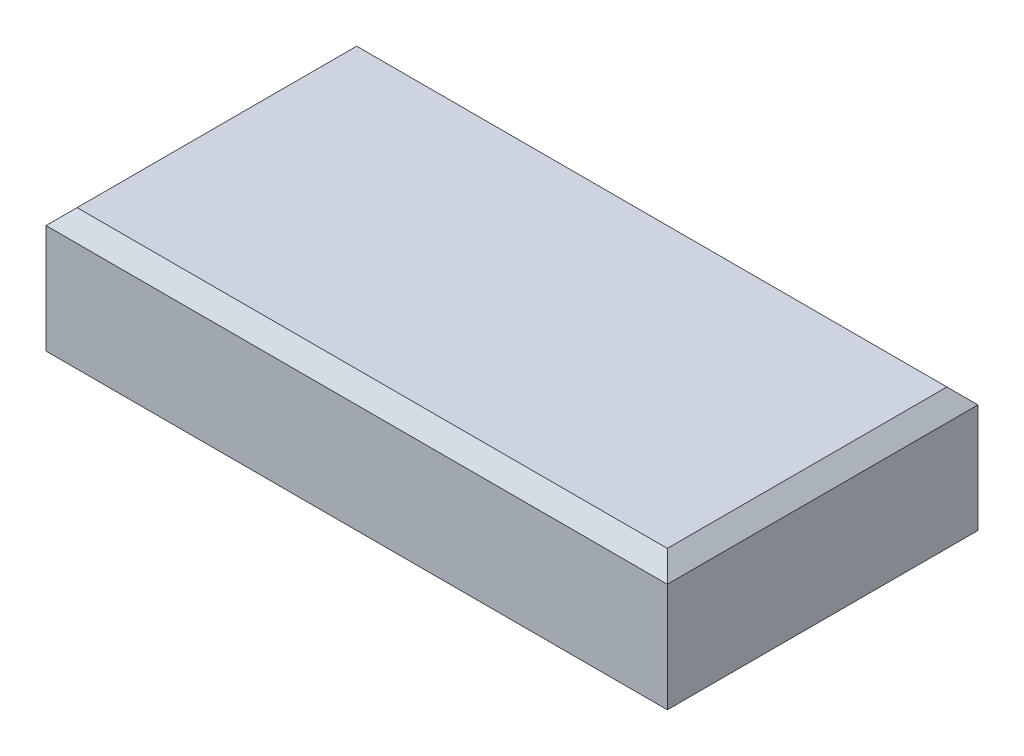
ISO-10303-21;
HEADER;
FILE_DESCRIPTION(('STEP AP214'),'2;1');
FILE_NAME('part.step','',(''),(''),'','','');
FILE_SCHEMA(('AUTOMOTIVE_DESIGN { 1 0 10303 214 1 1 1 1 }'));
ENDSEC;
DATA;
#1=APPLICATION_CONTEXT('core data for automotive mechanical design processes');
#2=APPLICATION_PROTOCOL_DEFINITION('international standard','automotive_design',2000,#1);
#3=PRODUCT_CONTEXT('',#1,'mechanical');
#4=PRODUCT('Part','Part','',(#3));
#5=PRODUCT_RELATED_PRODUCT_CATEGORY('part','',(#4));
#6=PRODUCT_DEFINITION_FORMATION('','',#4);
#7=PRODUCT_DEFINITION_CONTEXT('part definition',#1,'design');
#8=PRODUCT_DEFINITION('design','',#6,#7);
#9=PRODUCT_DEFINITION_SHAPE('','',#8);
#10=(LENGTH_UNIT() NAMED_UNIT(*) SI_UNIT(.MILLI.,.METRE.));
#11=(NAMED_UNIT(*) PLANE_ANGLE_UNIT() SI_UNIT($,.RADIAN.));
#12=(NAMED_UNIT(*) SI_UNIT($,.STERADIAN.) SOLID_ANGLE_UNIT());
#13=UNCERTAINTY_MEASURE_WITH_UNIT(LENGTH_MEASURE(1.E-05),#10,'distance_accuracy_value','');
#14=(GEOMETRIC_REPRESENTATION_CONTEXT(3) GLOBAL_UNCERTAINTY_ASSIGNED_CONTEXT((#13)) GLOBAL_UNIT_ASSIGNED_CONTEXT((#10,
#11,#12)) REPRESENTATION_CONTEXT('',''));
#15=CARTESIAN_POINT('',(0.,0.,0.));
#16=DIRECTION('',(0.,0.,1.));
#17=DIRECTION('',(1.,0.,0.));
#18=AXIS2_PLACEMENT_3D('',#15,#16,#17);
#19=CARTESIAN_POINT('',(20.,8.,7.68149882903981));
#20=DIRECTION('',(-1.,0.,0.));
#21=DIRECTION('',(0.,0.,1.));
#22=AXIS2_PLACEMENT_3D('',#19,#20,#21);
#23=PLANE('',#22);
#24=DIRECTION('',(0.,-1.,0.));
#25=VECTOR('',#24,1.);
#26=CARTESIAN_POINT('',(20.,8.,-12.3185011709602));
#27=LINE('',#26,#25);
#28=CARTESIAN_POINT('',(20.,6.99999999999999,-12.3185011709602));
#29=VERTEX_POINT('',#28);
#30=CARTESIAN_POINT('',(20.,0.,-12.3185011709602));
#31=VERTEX_POINT('',#30);
#32=EDGE_CURVE('E85',#29,#31,#27,.T.);
#33=ORIENTED_EDGE('',*,*,#32,.F.);
#34=DIRECTION('',(0.,0.,1.));
#35=VECTOR('',#34,1.);
#36=CARTESIAN_POINT('',(20.,6.99999999999999,7.68149882903981));
#37=LINE('',#36,#35);
#38=CARTESIAN_POINT('',(20.,6.99999999999999,7.68149882903981));
#39=VERTEX_POINT('',#38);
#40=EDGE_CURVE('E11',#29,#39,#37,.T.);
#41=ORIENTED_EDGE('',*,*,#40,.T.);
#42=DIRECTION('',(0.,-1.,0.));
#43=VECTOR('',#42,1.);
#44=CARTESIAN_POINT('',(20.,8.,7.68149882903981));
#45=LINE('',#44,#43);
#46=CARTESIAN_POINT('',(20.,0.,7.68149882903981));
#47=VERTEX_POINT('',#46);
#48=EDGE_CURVE('E105',#39,#47,#45,.T.);
#49=ORIENTED_EDGE('',*,*,#48,.T.);
#50=DIRECTION('',(0.,0.,-1.));
#51=VECTOR('',#50,1.);
#52=CARTESIAN_POINT('',(20.,0.,7.68149882903981));
#53=LINE('',#52,#51);
#54=EDGE_CURVE('E100',#47,#31,#53,.T.);
#55=ORIENTED_EDGE('',*,*,#54,.T.);
#56=EDGE_LOOP('',(#33,#41,#49,#55));
#57=FACE_BOUND('',#56,.T.);
#58=ADVANCED_FACE('F33',(#57),#23,.F.);
#59=CARTESIAN_POINT('',(-20.,8.,-12.3185011709602));
#60=DIRECTION('',(0.,0.,1.));
#61=DIRECTION('',(1.,0.,0.));
#62=AXIS2_PLACEMENT_3D('',#59,#60,#61);
#63=PLANE('',#62);
#64=DIRECTION('',(0.,-1.,0.));
#65=VECTOR('',#64,1.);
#66=CARTESIAN_POINT('',(-20.,8.,-12.3185011709602));
#67=LINE('',#66,#65);
#68=CARTESIAN_POINT('',(-20.,6.99999999999999,-12.3185011709602));
#69=VERTEX_POINT('',#68);
#70=CARTESIAN_POINT('',(-20.,0.,-12.3185011709602));
#71=VERTEX_POINT('',#70);
#72=EDGE_CURVE('E94',#69,#71,#67,.T.);
#73=ORIENTED_EDGE('',*,*,#72,.F.);
#74=DIRECTION('',(1.,0.,0.));
#75=VECTOR('',#74,1.);
#76=CARTESIAN_POINT('',(-20.,6.99999999999999,-12.3185011709602));
#77=LINE('',#76,#75);
#78=EDGE_CURVE('E42',#69,#29,#77,.T.);
#79=ORIENTED_EDGE('',*,*,#78,.T.);
#80=ORIENTED_EDGE('',*,*,#32,.T.);
#81=DIRECTION('',(-1.,0.,0.));
#82=VECTOR('',#81,1.);
#83=CARTESIAN_POINT('',(-20.,0.,-12.3185011709602));
#84=LINE('',#83,#82);
#85=EDGE_CURVE('E88',#31,#71,#84,.T.);
#86=ORIENTED_EDGE('',*,*,#85,.T.);
#87=EDGE_LOOP('',(#73,#79,#80,#86));
#88=FACE_BOUND('',#87,.T.);
#89=ADVANCED_FACE('F87',(#88),#63,.F.);
#90=CARTESIAN_POINT('',(-20.,8.,7.68149882903981));
#91=DIRECTION('',(1.,0.,0.));
#92=DIRECTION('',(0.,0.,-1.));
#93=AXIS2_PLACEMENT_3D('',#90,#91,#92);
#94=PLANE('',#93);
#95=DIRECTION('',(0.,-1.,0.));
#96=VECTOR('',#95,1.);
#97=CARTESIAN_POINT('',(-20.,8.,7.68149882903981));
#98=LINE('',#97,#96);
#99=CARTESIAN_POINT('',(-20.,6.99999999999999,7.68149882903981));
#100=VERTEX_POINT('',#99);
#101=CARTESIAN_POINT('',(-20.,0.,7.68149882903981));
#102=VERTEX_POINT('',#101);
#103=EDGE_CURVE('E115',#100,#102,#98,.T.);
#104=ORIENTED_EDGE('',*,*,#103,.F.);
#105=DIRECTION('',(0.,0.,-1.));
#106=VECTOR('',#105,1.);
#107=CARTESIAN_POINT('',(-20.,6.99999999999999,7.68149882903981));
#108=LINE('',#107,#106);
#109=EDGE_CURVE('E57',#100,#69,#108,.T.);
#110=ORIENTED_EDGE('',*,*,#109,.T.);
#111=ORIENTED_EDGE('',*,*,#72,.T.);
#112=DIRECTION('',(0.,0.,1.));
#113=VECTOR('',#112,1.);
#114=CARTESIAN_POINT('',(-20.,0.,7.68149882903981));
#115=LINE('',#114,#113);
#116=EDGE_CURVE('E102',#71,#102,#115,.T.);
#117=ORIENTED_EDGE('',*,*,#116,.T.);
#118=EDGE_LOOP('',(#104,#110,#111,#117));
#119=FACE_BOUND('',#118,.T.);
#120=ADVANCED_FACE('F153',(#119),#94,.F.);
#121=CARTESIAN_POINT('',(-20.,8.,7.68149882903981));
#122=DIRECTION('',(0.,0.,-1.));
#123=DIRECTION('',(-1.,0.,0.));
#124=AXIS2_PLACEMENT_3D('',#121,#122,#123);
#125=PLANE('',#124);
#126=ORIENTED_EDGE('',*,*,#48,.F.);
#127=DIRECTION('',(-1.,0.,0.));
#128=VECTOR('',#127,1.);
#129=CARTESIAN_POINT('',(-20.,6.99999999999999,7.68149882903981));
#130=LINE('',#129,#128);
#131=EDGE_CURVE('E126',#39,#100,#130,.T.);
#132=ORIENTED_EDGE('',*,*,#131,.T.);
#133=ORIENTED_EDGE('',*,*,#103,.T.);
#134=DIRECTION('',(1.,0.,0.));
#135=VECTOR('',#134,1.);
#136=CARTESIAN_POINT('',(-20.,0.,7.68149882903981));
#137=LINE('',#136,#135);
#138=EDGE_CURVE('E112',#102,#47,#137,.T.);
#139=ORIENTED_EDGE('',*,*,#138,.T.);
#140=EDGE_LOOP('',(#126,#132,#133,#139));
#141=FACE_BOUND('',#140,.T.);
#142=ADVANCED_FACE('F152',(#141),#125,.F.);
#143=CARTESIAN_POINT('',(0.,8.,0.));
#144=DIRECTION('',(0.,-1.,0.));
#145=DIRECTION('',(0.,0.,-1.));
#146=AXIS2_PLACEMENT_3D('',#143,#144,#145);
#147=PLANE('',#146);
#148=DIRECTION('',(0.,0.,1.));
#149=VECTOR('',#148,1.);
#150=CARTESIAN_POINT('',(-19.,8.,0.));
#151=LINE('',#150,#149);
#152=CARTESIAN_POINT('',(-19.,8.,-11.3185011709602));
#153=VERTEX_POINT('',#152);
#154=CARTESIAN_POINT('',(-19.,8.,6.68149882903981));
#155=VERTEX_POINT('',#154);
#156=EDGE_CURVE('E121',#153,#155,#151,.T.);
#157=ORIENTED_EDGE('',*,*,#156,.T.);
#158=DIRECTION('',(1.,0.,0.));
#159=VECTOR('',#158,1.);
#160=CARTESIAN_POINT('',(0.,8.,6.68149882903981));
#161=LINE('',#160,#159);
#162=CARTESIAN_POINT('',(19.,8.,6.68149882903981));
#163=VERTEX_POINT('',#162);
#164=EDGE_CURVE('E123',#155,#163,#161,.T.);
#165=ORIENTED_EDGE('',*,*,#164,.T.);
#166=DIRECTION('',(0.,0.,-1.));
#167=VECTOR('',#166,1.);
#168=CARTESIAN_POINT('',(19.,8.,0.));
#169=LINE('',#168,#167);
#170=CARTESIAN_POINT('',(19.,8.,-11.3185011709602));
#171=VERTEX_POINT('',#170);
#172=EDGE_CURVE('E93',#163,#171,#169,.T.);
#173=ORIENTED_EDGE('',*,*,#172,.T.);
#174=DIRECTION('',(-1.,0.,0.));
#175=VECTOR('',#174,1.);
#176=CARTESIAN_POINT('',(0.,8.,-11.3185011709602));
#177=LINE('',#176,#175);
#178=EDGE_CURVE('E119',#171,#153,#177,.T.);
#179=ORIENTED_EDGE('',*,*,#178,.T.);
#180=EDGE_LOOP('',(#157,#165,#173,#179));
#181=FACE_BOUND('',#180,.T.);
#182=ADVANCED_FACE('F145',(#181),#147,.F.);
#183=CARTESIAN_POINT('',(0.,0.,0.));
#184=DIRECTION('',(0.,-1.,0.));
#185=DIRECTION('',(0.,0.,-1.));
#186=AXIS2_PLACEMENT_3D('',#183,#184,#185);
#187=PLANE('',#186);
#188=ORIENTED_EDGE('',*,*,#54,.F.);
#189=ORIENTED_EDGE('',*,*,#138,.F.);
#190=ORIENTED_EDGE('',*,*,#116,.F.);
#191=ORIENTED_EDGE('',*,*,#85,.F.);
#192=EDGE_LOOP('',(#188,#189,#190,#191));
#193=FACE_BOUND('',#192,.T.);
#194=ADVANCED_FACE('F98',(#193),#187,.T.);
#195=CARTESIAN_POINT('',(0.,8.,-11.3185011709602));
#196=DIRECTION('',(0.,-0.707106781186547,0.707106781186547));
#197=DIRECTION('',(-1.,0.,0.));
#198=AXIS2_PLACEMENT_3D('',#195,#196,#197);
#199=PLANE('',#198);
#200=DIRECTION('',(-0.577350269189626,0.577350269189626,0.577350269189626));
#201=VECTOR('',#200,1.);
#202=CARTESIAN_POINT('',(15.2271662763466,11.7728337236534,-7.54566744730679));
#203=LINE('',#202,#201);
#204=EDGE_CURVE('E109',#29,#171,#203,.T.);
#205=ORIENTED_EDGE('',*,*,#204,.F.);
#206=ORIENTED_EDGE('',*,*,#78,.F.);
#207=DIRECTION('',(0.577350269189626,0.577350269189626,0.577350269189626));
#208=VECTOR('',#207,1.);
#209=CARTESIAN_POINT('',(-12.6666666666667,14.3333333333333,-4.98516783762685));
#210=LINE('',#209,#208);
#211=EDGE_CURVE('E37',#153,#69,#210,.F.);
#212=ORIENTED_EDGE('',*,*,#211,.F.);
#213=ORIENTED_EDGE('',*,*,#178,.F.);
#214=EDGE_LOOP('',(#205,#206,#212,#213));
#215=FACE_BOUND('',#214,.T.);
#216=ADVANCED_FACE('F35',(#215),#199,.F.);
#217=CARTESIAN_POINT('',(-19.,8.,0.));
#218=DIRECTION('',(0.707106781186547,-0.707106781186547,0.));
#219=DIRECTION('',(0.,0.,1.));
#220=AXIS2_PLACEMENT_3D('',#217,#218,#219);
#221=PLANE('',#220);
#222=ORIENTED_EDGE('',*,*,#211,.T.);
#223=ORIENTED_EDGE('',*,*,#109,.F.);
#224=DIRECTION('',(0.577350269189626,0.577350269189626,-0.577350269189626));
#225=VECTOR('',#224,1.);
#226=CARTESIAN_POINT('',(-16.7728337236534,10.2271662763466,4.45433255269321));
#227=LINE('',#226,#225);
#228=EDGE_CURVE('E133',#155,#100,#227,.F.);
#229=ORIENTED_EDGE('',*,*,#228,.F.);
#230=ORIENTED_EDGE('',*,*,#156,.F.);
#231=EDGE_LOOP('',(#222,#223,#229,#230));
#232=FACE_BOUND('',#231,.T.);
#233=ADVANCED_FACE('F170',(#232),#221,.F.);
#234=CARTESIAN_POINT('',(19.,8.,0.));
#235=DIRECTION('',(-0.707106781186547,-0.707106781186547,0.));
#236=DIRECTION('',(0.,0.,-1.));
#237=AXIS2_PLACEMENT_3D('',#234,#235,#236);
#238=PLANE('',#237);
#239=ORIENTED_EDGE('',*,*,#204,.T.);
#240=ORIENTED_EDGE('',*,*,#172,.F.);
#241=DIRECTION('',(0.577350269189626,-0.577350269189626,0.577350269189626));
#242=VECTOR('',#241,1.);
#243=CARTESIAN_POINT('',(16.7728337236534,10.2271662763466,4.45433255269321));
#244=LINE('',#243,#242);
#245=EDGE_CURVE('E131',#39,#163,#244,.F.);
#246=ORIENTED_EDGE('',*,*,#245,.F.);
#247=ORIENTED_EDGE('',*,*,#40,.F.);
#248=EDGE_LOOP('',(#239,#240,#246,#247));
#249=FACE_BOUND('',#248,.T.);
#250=ADVANCED_FACE('F138',(#249),#238,.F.);
#251=CARTESIAN_POINT('',(0.,8.,6.68149882903981));
#252=DIRECTION('',(0.,-0.707106781186547,-0.707106781186547));
#253=DIRECTION('',(1.,0.,0.));
#254=AXIS2_PLACEMENT_3D('',#251,#252,#253);
#255=PLANE('',#254);
#256=ORIENTED_EDGE('',*,*,#228,.T.);
#257=ORIENTED_EDGE('',*,*,#131,.F.);
#258=ORIENTED_EDGE('',*,*,#245,.T.);
#259=ORIENTED_EDGE('',*,*,#164,.F.);
#260=EDGE_LOOP('',(#256,#257,#258,#259));
#261=FACE_BOUND('',#260,.T.);
#262=ADVANCED_FACE('F149',(#261),#255,.F.);
#263=CLOSED_SHELL('',(#58,#89,#120,#142,#182,#194,#216,#233,#250,#262));
#264=MANIFOLD_SOLID_BREP('B2',#263);
#265=ADVANCED_BREP_SHAPE_REPRESENTATION('',(#18,#264),#14);
#266=SHAPE_DEFINITION_REPRESENTATION(#9,#265);
ENDSEC;
END-ISO-10303-21;
